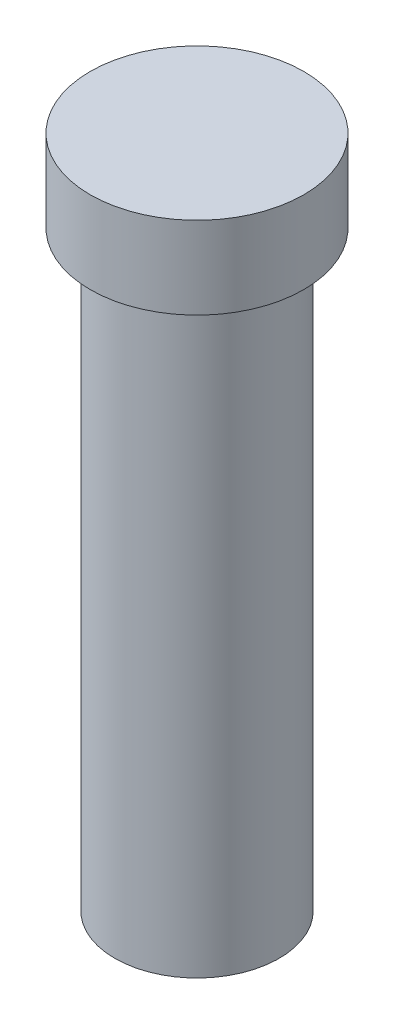
ISO-10303-21;
HEADER;
FILE_DESCRIPTION(('STEP AP214'),'2;1');
FILE_NAME('part.step','',(''),(''),'','','');
FILE_SCHEMA(('AUTOMOTIVE_DESIGN { 1 0 10303 214 1 1 1 1 }'));
ENDSEC;
DATA;
#1=APPLICATION_CONTEXT('core data for automotive mechanical design processes');
#2=APPLICATION_PROTOCOL_DEFINITION('international standard','automotive_design',2000,#1);
#3=PRODUCT_CONTEXT('',#1,'mechanical');
#4=PRODUCT('Part','Part','',(#3));
#5=PRODUCT_RELATED_PRODUCT_CATEGORY('part','',(#4));
#6=PRODUCT_DEFINITION_FORMATION('','',#4);
#7=PRODUCT_DEFINITION_CONTEXT('part definition',#1,'design');
#8=PRODUCT_DEFINITION('design','',#6,#7);
#9=PRODUCT_DEFINITION_SHAPE('','',#8);
#10=(LENGTH_UNIT() NAMED_UNIT(*) SI_UNIT(.MILLI.,.METRE.));
#11=(NAMED_UNIT(*) PLANE_ANGLE_UNIT() SI_UNIT($,.RADIAN.));
#12=(NAMED_UNIT(*) SI_UNIT($,.STERADIAN.) SOLID_ANGLE_UNIT());
#13=UNCERTAINTY_MEASURE_WITH_UNIT(LENGTH_MEASURE(1.E-05),#10,'distance_accuracy_value','');
#14=(GEOMETRIC_REPRESENTATION_CONTEXT(3) GLOBAL_UNCERTAINTY_ASSIGNED_CONTEXT((#13)) GLOBAL_UNIT_ASSIGNED_CONTEXT((#10,
#11,#12)) REPRESENTATION_CONTEXT('',''));
#15=CARTESIAN_POINT('',(0.,0.,0.));
#16=DIRECTION('',(0.,0.,1.));
#17=DIRECTION('',(1.,0.,0.));
#18=AXIS2_PLACEMENT_3D('',#15,#16,#17);
#19=CARTESIAN_POINT('',(0.,0.,0.));
#20=DIRECTION('',(0.,-1.,0.));
#21=DIRECTION('',(0.,0.,-1.));
#22=AXIS2_PLACEMENT_3D('',#19,#20,#21);
#23=PLANE('',#22);
#24=CARTESIAN_POINT('',(0.,0.,0.));
#25=DIRECTION('',(0.,1.,0.));
#26=DIRECTION('',(0.,0.,1.));
#27=AXIS2_PLACEMENT_3D('',#24,#25,#26);
#28=CIRCLE('',#27,6.5);
#29=CARTESIAN_POINT('',(0.,0.,6.5));
#30=VERTEX_POINT('',#29);
#31=EDGE_CURVE('E10',#30,#30,#28,.T.);
#32=ORIENTED_EDGE('',*,*,#31,.T.);
#33=EDGE_LOOP('',(#32));
#34=FACE_BOUND('',#33,.T.);
#35=ADVANCED_FACE('F40',(#34),#23,.F.);
#36=CARTESIAN_POINT('',(0.,8.47697308897347,0.));
#37=DIRECTION('',(0.,1.,0.));
#38=DIRECTION('',(0.,0.,1.));
#39=AXIS2_PLACEMENT_3D('',#36,#37,#38);
#40=CYLINDRICAL_SURFACE('',#39,6.5);
#41=ORIENTED_EDGE('',*,*,#31,.F.);
#42=EDGE_LOOP('',(#41));
#43=FACE_BOUND('',#42,.T.);
#44=CARTESIAN_POINT('',(0.,-5.,0.));
#45=DIRECTION('',(0.,1.,0.));
#46=DIRECTION('',(0.,0.,1.));
#47=AXIS2_PLACEMENT_3D('',#44,#45,#46);
#48=CIRCLE('',#47,6.5);
#49=CARTESIAN_POINT('',(0.,-5.,6.5));
#50=VERTEX_POINT('',#49);
#51=EDGE_CURVE('E47',#50,#50,#48,.T.);
#52=ORIENTED_EDGE('',*,*,#51,.T.);
#53=EDGE_LOOP('',(#52));
#54=FACE_BOUND('',#53,.T.);
#55=ADVANCED_FACE('F79',(#43,#54),#40,.T.);
#56=CARTESIAN_POINT('',(6.5,-5.,0.));
#57=DIRECTION('',(0.,1.,0.));
#58=DIRECTION('',(0.,0.,1.));
#59=AXIS2_PLACEMENT_3D('',#56,#57,#58);
#60=PLANE('',#59);
#61=ORIENTED_EDGE('',*,*,#51,.F.);
#62=EDGE_LOOP('',(#61));
#63=FACE_BOUND('',#62,.T.);
#64=CARTESIAN_POINT('',(0.,-5.,0.));
#65=DIRECTION('',(0.,1.,0.));
#66=DIRECTION('',(0.,0.,1.));
#67=AXIS2_PLACEMENT_3D('',#64,#65,#66);
#68=CIRCLE('',#67,5.);
#69=CARTESIAN_POINT('',(0.,-5.,5.));
#70=VERTEX_POINT('',#69);
#71=EDGE_CURVE('E53',#70,#70,#68,.T.);
#72=ORIENTED_EDGE('',*,*,#71,.T.);
#73=EDGE_LOOP('',(#72));
#74=FACE_BOUND('',#73,.T.);
#75=ADVANCED_FACE('F75',(#63,#74),#60,.F.);
#76=CARTESIAN_POINT('',(0.,8.47697308897347,0.));
#77=DIRECTION('',(0.,1.,0.));
#78=DIRECTION('',(0.,0.,1.));
#79=AXIS2_PLACEMENT_3D('',#76,#77,#78);
#80=CYLINDRICAL_SURFACE('',#79,5.);
#81=ORIENTED_EDGE('',*,*,#71,.F.);
#82=EDGE_LOOP('',(#81));
#83=FACE_BOUND('',#82,.T.);
#84=CARTESIAN_POINT('',(0.,-41.,0.));
#85=DIRECTION('',(0.,1.,0.));
#86=DIRECTION('',(0.,0.,1.));
#87=AXIS2_PLACEMENT_3D('',#84,#85,#86);
#88=CIRCLE('',#87,5.00000000000001);
#89=CARTESIAN_POINT('',(0.,-41.,5.00000000000001));
#90=VERTEX_POINT('',#89);
#91=EDGE_CURVE('E59',#90,#90,#88,.T.);
#92=ORIENTED_EDGE('',*,*,#91,.T.);
#93=EDGE_LOOP('',(#92));
#94=FACE_BOUND('',#93,.T.);
#95=ADVANCED_FACE('F67',(#83,#94),#80,.T.);
#96=CARTESIAN_POINT('',(5.00000000000001,-41.,0.));
#97=DIRECTION('',(0.,1.,0.));
#98=DIRECTION('',(0.,0.,1.));
#99=AXIS2_PLACEMENT_3D('',#96,#97,#98);
#100=PLANE('',#99);
#101=ORIENTED_EDGE('',*,*,#91,.F.);
#102=EDGE_LOOP('',(#101));
#103=FACE_BOUND('',#102,.T.);
#104=ADVANCED_FACE('F69',(#103),#100,.F.);
#105=CLOSED_SHELL('',(#35,#55,#75,#95,#104));
#106=MANIFOLD_SOLID_BREP('B2',#105);
#107=ADVANCED_BREP_SHAPE_REPRESENTATION('',(#18,#106),#14);
#108=SHAPE_DEFINITION_REPRESENTATION(#9,#107);
ENDSEC;
END-ISO-10303-21;
